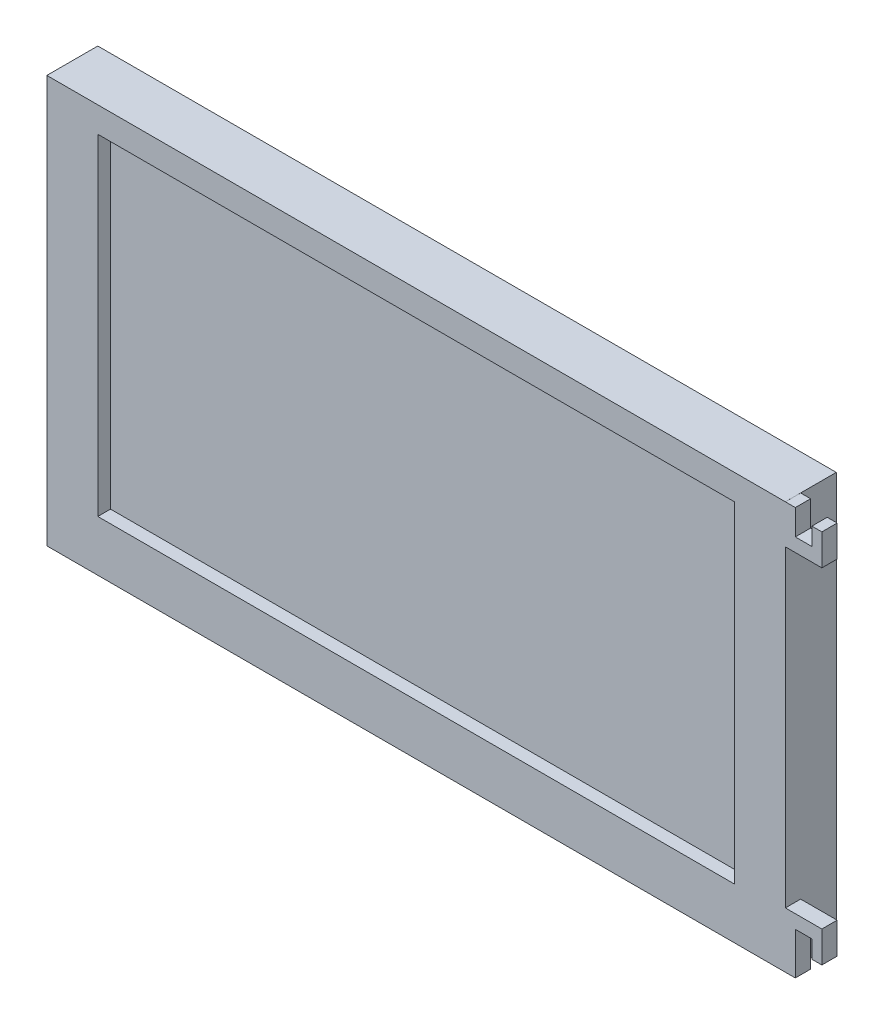
ISO-10303-21;
HEADER;
FILE_DESCRIPTION(('STEP AP214'),'2;1');
FILE_NAME('part.step','',(''),(''),'','','');
FILE_SCHEMA(('AUTOMOTIVE_DESIGN { 1 0 10303 214 1 1 1 1 }'));
ENDSEC;
DATA;
#1=APPLICATION_CONTEXT('core data for automotive mechanical design processes');
#2=APPLICATION_PROTOCOL_DEFINITION('international standard','automotive_design',2000,#1);
#3=PRODUCT_CONTEXT('',#1,'mechanical');
#4=PRODUCT('Part','Part','',(#3));
#5=PRODUCT_RELATED_PRODUCT_CATEGORY('part','',(#4));
#6=PRODUCT_DEFINITION_FORMATION('','',#4);
#7=PRODUCT_DEFINITION_CONTEXT('part definition',#1,'design');
#8=PRODUCT_DEFINITION('design','',#6,#7);
#9=PRODUCT_DEFINITION_SHAPE('','',#8);
#10=(LENGTH_UNIT() NAMED_UNIT(*) SI_UNIT(.MILLI.,.METRE.));
#11=(NAMED_UNIT(*) PLANE_ANGLE_UNIT() SI_UNIT($,.RADIAN.));
#12=(NAMED_UNIT(*) SI_UNIT($,.STERADIAN.) SOLID_ANGLE_UNIT());
#13=UNCERTAINTY_MEASURE_WITH_UNIT(LENGTH_MEASURE(1.E-05),#10,'distance_accuracy_value','');
#14=(GEOMETRIC_REPRESENTATION_CONTEXT(3) GLOBAL_UNCERTAINTY_ASSIGNED_CONTEXT((#13)) GLOBAL_UNIT_ASSIGNED_CONTEXT((#10,
#11,#12)) REPRESENTATION_CONTEXT('',''));
#15=CARTESIAN_POINT('',(0.,0.,0.));
#16=DIRECTION('',(0.,0.,1.));
#17=DIRECTION('',(1.,0.,0.));
#18=AXIS2_PLACEMENT_3D('',#15,#16,#17);
#19=CARTESIAN_POINT('',(184.15,101.6,12.7));
#20=DIRECTION('',(-1.,0.,0.));
#21=DIRECTION('',(0.,0.,1.));
#22=AXIS2_PLACEMENT_3D('',#19,#20,#21);
#23=PLANE('',#22);
#24=DIRECTION('',(0.,1.,0.));
#25=VECTOR('',#24,1.);
#26=CARTESIAN_POINT('',(184.15,101.6,12.7));
#27=LINE('',#26,#25);
#28=CARTESIAN_POINT('',(184.15,101.584884773139,12.7));
#29=VERTEX_POINT('',#28);
#30=CARTESIAN_POINT('',(184.15,101.6,12.7));
#31=VERTEX_POINT('',#30);
#32=EDGE_CURVE('E359',#29,#31,#27,.T.);
#33=ORIENTED_EDGE('',*,*,#32,.F.);
#34=DIRECTION('',(0.,0.,1.));
#35=VECTOR('',#34,1.);
#36=CARTESIAN_POINT('',(184.15,101.584884773139,5.08));
#37=LINE('',#36,#35);
#38=CARTESIAN_POINT('',(184.15,101.584884773139,5.08));
#39=VERTEX_POINT('',#38);
#40=EDGE_CURVE('E221',#39,#29,#37,.T.);
#41=ORIENTED_EDGE('',*,*,#40,.F.);
#42=DIRECTION('',(0.,-1.,0.));
#43=VECTOR('',#42,1.);
#44=CARTESIAN_POINT('',(184.15,88.0125906923723,5.08));
#45=LINE('',#44,#43);
#46=CARTESIAN_POINT('',(184.15,82.1604398677149,5.08));
#47=VERTEX_POINT('',#46);
#48=EDGE_CURVE('E213',#39,#47,#45,.T.);
#49=ORIENTED_EDGE('',*,*,#48,.T.);
#50=DIRECTION('',(0.,0.,1.));
#51=VECTOR('',#50,1.);
#52=CARTESIAN_POINT('',(184.15,82.1604398677149,5.08));
#53=LINE('',#52,#51);
#54=CARTESIAN_POINT('',(184.15,82.1604398677149,12.7));
#55=VERTEX_POINT('',#54);
#56=EDGE_CURVE('E196',#47,#55,#53,.T.);
#57=ORIENTED_EDGE('',*,*,#56,.T.);
#58=CARTESIAN_POINT('',(184.15,-73.8206556166965,12.7));
#59=VERTEX_POINT('',#58);
#60=EDGE_CURVE('E360',#59,#55,#27,.T.);
#61=ORIENTED_EDGE('',*,*,#60,.F.);
#62=DIRECTION('',(0.,0.,1.));
#63=VECTOR('',#62,1.);
#64=CARTESIAN_POINT('',(184.15,-73.8206556166965,5.08));
#65=LINE('',#64,#63);
#66=CARTESIAN_POINT('',(184.15,-73.8206556166965,5.08));
#67=VERTEX_POINT('',#66);
#68=EDGE_CURVE('E306',#67,#59,#65,.T.);
#69=ORIENTED_EDGE('',*,*,#68,.F.);
#70=DIRECTION('',(0.,-1.,0.));
#71=VECTOR('',#70,1.);
#72=CARTESIAN_POINT('',(184.15,-101.6,5.08));
#73=LINE('',#72,#71);
#74=CARTESIAN_POINT('',(184.15,-101.6,5.08));
#75=VERTEX_POINT('',#74);
#76=EDGE_CURVE('E267',#67,#75,#73,.T.);
#77=ORIENTED_EDGE('',*,*,#76,.T.);
#78=DIRECTION('',(0.,0.,-1.));
#79=VECTOR('',#78,1.);
#80=CARTESIAN_POINT('',(184.15,-101.6,12.7));
#81=LINE('',#80,#79);
#82=CARTESIAN_POINT('',(184.15,-101.6,-12.7));
#83=VERTEX_POINT('',#82);
#84=EDGE_CURVE('E47',#75,#83,#81,.T.);
#85=ORIENTED_EDGE('',*,*,#84,.T.);
#86=DIRECTION('',(0.,1.,0.));
#87=VECTOR('',#86,1.);
#88=CARTESIAN_POINT('',(184.15,101.6,-12.7));
#89=LINE('',#88,#87);
#90=CARTESIAN_POINT('',(184.15,101.6,-12.7));
#91=VERTEX_POINT('',#90);
#92=EDGE_CURVE('E370',#83,#91,#89,.T.);
#93=ORIENTED_EDGE('',*,*,#92,.T.);
#94=DIRECTION('',(0.,0.,-1.));
#95=VECTOR('',#94,1.);
#96=CARTESIAN_POINT('',(184.15,101.6,12.7));
#97=LINE('',#96,#95);
#98=EDGE_CURVE('E375',#31,#91,#97,.T.);
#99=ORIENTED_EDGE('',*,*,#98,.F.);
#100=EDGE_LOOP('',(#33,#41,#49,#57,#61,#69,#77,#85,#93,#99));
#101=FACE_BOUND('',#100,.T.);
#102=ADVANCED_FACE('F39',(#101),#23,.F.);
#103=CARTESIAN_POINT('',(-184.15,101.6,12.7));
#104=DIRECTION('',(1.,0.,0.));
#105=DIRECTION('',(0.,0.,-1.));
#106=AXIS2_PLACEMENT_3D('',#103,#104,#105);
#107=PLANE('',#106);
#108=DIRECTION('',(0.,-1.,0.));
#109=VECTOR('',#108,1.);
#110=CARTESIAN_POINT('',(-184.15,101.6,-12.7));
#111=LINE('',#110,#109);
#112=CARTESIAN_POINT('',(-184.15,101.6,-12.7));
#113=VERTEX_POINT('',#112);
#114=CARTESIAN_POINT('',(-184.15,-101.6,-12.7));
#115=VERTEX_POINT('',#114);
#116=EDGE_CURVE('E346',#113,#115,#111,.T.);
#117=ORIENTED_EDGE('',*,*,#116,.T.);
#118=DIRECTION('',(0.,0.,-1.));
#119=VECTOR('',#118,1.);
#120=CARTESIAN_POINT('',(-184.15,-101.6,12.7));
#121=LINE('',#120,#119);
#122=CARTESIAN_POINT('',(-184.15,-101.6,12.7));
#123=VERTEX_POINT('',#122);
#124=EDGE_CURVE('E11',#123,#115,#121,.T.);
#125=ORIENTED_EDGE('',*,*,#124,.F.);
#126=DIRECTION('',(0.,-1.,0.));
#127=VECTOR('',#126,1.);
#128=CARTESIAN_POINT('',(-184.15,101.6,12.7));
#129=LINE('',#128,#127);
#130=CARTESIAN_POINT('',(-184.15,101.6,12.7));
#131=VERTEX_POINT('',#130);
#132=EDGE_CURVE('E353',#131,#123,#129,.T.);
#133=ORIENTED_EDGE('',*,*,#132,.F.);
#134=DIRECTION('',(0.,0.,-1.));
#135=VECTOR('',#134,1.);
#136=CARTESIAN_POINT('',(-184.15,101.6,12.7));
#137=LINE('',#136,#135);
#138=EDGE_CURVE('E364',#131,#113,#137,.T.);
#139=ORIENTED_EDGE('',*,*,#138,.T.);
#140=EDGE_LOOP('',(#117,#125,#133,#139));
#141=FACE_BOUND('',#140,.T.);
#142=ADVANCED_FACE('F41',(#141),#107,.F.);
#143=CARTESIAN_POINT('',(-184.15,-101.6,12.7));
#144=DIRECTION('',(0.,1.,0.));
#145=DIRECTION('',(0.,0.,1.));
#146=AXIS2_PLACEMENT_3D('',#143,#144,#145);
#147=PLANE('',#146);
#148=DIRECTION('',(1.,0.,0.));
#149=VECTOR('',#148,1.);
#150=CARTESIAN_POINT('',(-184.15,-101.6,-12.7));
#151=LINE('',#150,#149);
#152=EDGE_CURVE('E367',#115,#83,#151,.T.);
#153=ORIENTED_EDGE('',*,*,#152,.T.);
#154=ORIENTED_EDGE('',*,*,#84,.F.);
#155=DIRECTION('',(1.,0.,0.));
#156=VECTOR('',#155,1.);
#157=CARTESIAN_POINT('',(184.15,-101.6,5.08));
#158=LINE('',#157,#156);
#159=CARTESIAN_POINT('',(189.1197006928,-101.6,5.08));
#160=VERTEX_POINT('',#159);
#161=EDGE_CURVE('E62',#75,#160,#158,.T.);
#162=ORIENTED_EDGE('',*,*,#161,.T.);
#163=DIRECTION('',(0.,0.,1.));
#164=VECTOR('',#163,1.);
#165=CARTESIAN_POINT('',(189.1197006928,-101.6,5.08));
#166=LINE('',#165,#164);
#167=CARTESIAN_POINT('',(189.1197006928,-101.6,12.7));
#168=VERTEX_POINT('',#167);
#169=EDGE_CURVE('E289',#160,#168,#166,.T.);
#170=ORIENTED_EDGE('',*,*,#169,.T.);
#171=DIRECTION('',(1.,0.,0.));
#172=VECTOR('',#171,1.);
#173=CARTESIAN_POINT('',(-184.15,-101.6,12.7));
#174=LINE('',#173,#172);
#175=EDGE_CURVE('E356',#123,#168,#174,.T.);
#176=ORIENTED_EDGE('',*,*,#175,.F.);
#177=ORIENTED_EDGE('',*,*,#124,.T.);
#178=EDGE_LOOP('',(#153,#154,#162,#170,#176,#177));
#179=FACE_BOUND('',#178,.T.);
#180=ADVANCED_FACE('F382',(#179),#147,.F.);
#181=CARTESIAN_POINT('',(-184.15,101.6,12.7));
#182=DIRECTION('',(0.,-1.,0.));
#183=DIRECTION('',(0.,0.,-1.));
#184=AXIS2_PLACEMENT_3D('',#181,#182,#183);
#185=PLANE('',#184);
#186=DIRECTION('',(-1.,0.,0.));
#187=VECTOR('',#186,1.);
#188=CARTESIAN_POINT('',(-184.15,101.6,-12.7));
#189=LINE('',#188,#187);
#190=EDGE_CURVE('E357',#91,#113,#189,.T.);
#191=ORIENTED_EDGE('',*,*,#190,.T.);
#192=ORIENTED_EDGE('',*,*,#138,.F.);
#193=DIRECTION('',(-1.,0.,0.));
#194=VECTOR('',#193,1.);
#195=CARTESIAN_POINT('',(-184.15,101.6,12.7));
#196=LINE('',#195,#194);
#197=EDGE_CURVE('E362',#31,#131,#196,.T.);
#198=ORIENTED_EDGE('',*,*,#197,.F.);
#199=ORIENTED_EDGE('',*,*,#98,.T.);
#200=EDGE_LOOP('',(#191,#192,#198,#199));
#201=FACE_BOUND('',#200,.T.);
#202=ADVANCED_FACE('F390',(#201),#185,.F.);
#203=CARTESIAN_POINT('',(0.,0.,12.7));
#204=DIRECTION('',(0.,0.,1.));
#205=DIRECTION('',(1.,0.,0.));
#206=AXIS2_PLACEMENT_3D('',#203,#204,#205);
#207=PLANE('',#206);
#208=DIRECTION('',(0.,-1.,0.));
#209=VECTOR('',#208,1.);
#210=CARTESIAN_POINT('',(-158.75,88.9,12.7));
#211=LINE('',#210,#209);
#212=CARTESIAN_POINT('',(-158.75,88.9,12.7));
#213=VERTEX_POINT('',#212);
#214=CARTESIAN_POINT('',(-158.75,-76.2,12.7));
#215=VERTEX_POINT('',#214);
#216=EDGE_CURVE('E308',#213,#215,#211,.T.);
#217=ORIENTED_EDGE('',*,*,#216,.F.);
#218=DIRECTION('',(-1.,0.,0.));
#219=VECTOR('',#218,1.);
#220=CARTESIAN_POINT('',(-158.75,88.9,12.7));
#221=LINE('',#220,#219);
#222=CARTESIAN_POINT('',(158.75,88.9,12.7));
#223=VERTEX_POINT('',#222);
#224=EDGE_CURVE('E325',#223,#213,#221,.T.);
#225=ORIENTED_EDGE('',*,*,#224,.F.);
#226=DIRECTION('',(0.,1.,0.));
#227=VECTOR('',#226,1.);
#228=CARTESIAN_POINT('',(158.75,88.9,12.7));
#229=LINE('',#228,#227);
#230=CARTESIAN_POINT('',(158.75,-76.2,12.7));
#231=VERTEX_POINT('',#230);
#232=EDGE_CURVE('E339',#231,#223,#229,.T.);
#233=ORIENTED_EDGE('',*,*,#232,.F.);
#234=DIRECTION('',(1.,0.,0.));
#235=VECTOR('',#234,1.);
#236=CARTESIAN_POINT('',(-158.75,-76.2,12.7));
#237=LINE('',#236,#235);
#238=EDGE_CURVE('E336',#215,#231,#237,.T.);
#239=ORIENTED_EDGE('',*,*,#238,.F.);
#240=EDGE_LOOP('',(#217,#225,#233,#239));
#241=FACE_BOUND('',#240,.T.);
#242=ORIENTED_EDGE('',*,*,#132,.T.);
#243=ORIENTED_EDGE('',*,*,#175,.T.);
#244=DIRECTION('',(0.,1.,0.));
#245=VECTOR('',#244,1.);
#246=CARTESIAN_POINT('',(189.1197006928,-101.6,12.7));
#247=LINE('',#246,#245);
#248=CARTESIAN_POINT('',(189.1197006928,-80.5602157489815,12.7));
#249=VERTEX_POINT('',#248);
#250=EDGE_CURVE('E255',#168,#249,#247,.T.);
#251=ORIENTED_EDGE('',*,*,#250,.T.);
#252=DIRECTION('',(1.,0.,0.));
#253=VECTOR('',#252,1.);
#254=CARTESIAN_POINT('',(189.1197006928,-80.5602157489815,12.7));
#255=LINE('',#254,#253);
#256=CARTESIAN_POINT('',(197.392455233142,-80.5602157489815,12.7));
#257=VERTEX_POINT('',#256);
#258=EDGE_CURVE('E292',#249,#257,#255,.T.);
#259=ORIENTED_EDGE('',*,*,#258,.T.);
#260=DIRECTION('',(0.,-1.,0.));
#261=VECTOR('',#260,1.);
#262=CARTESIAN_POINT('',(197.392455233142,-80.5602157489815,12.7));
#263=LINE('',#262,#261);
#264=CARTESIAN_POINT('',(197.392455233142,-89.3698935001561,12.7));
#265=VERTEX_POINT('',#264);
#266=EDGE_CURVE('E295',#257,#265,#263,.T.);
#267=ORIENTED_EDGE('',*,*,#266,.T.);
#268=DIRECTION('',(1.,0.,0.));
#269=VECTOR('',#268,1.);
#270=CARTESIAN_POINT('',(202.362155925942,-89.3698935001561,12.7));
#271=LINE('',#270,#269);
#272=CARTESIAN_POINT('',(202.362155925942,-89.3698935001561,12.7));
#273=VERTEX_POINT('',#272);
#274=EDGE_CURVE('E298',#265,#273,#271,.T.);
#275=ORIENTED_EDGE('',*,*,#274,.T.);
#276=DIRECTION('',(0.,1.,0.));
#277=VECTOR('',#276,1.);
#278=CARTESIAN_POINT('',(202.362155925942,-73.8206556166965,12.7));
#279=LINE('',#278,#277);
#280=CARTESIAN_POINT('',(202.362155925942,-73.8206556166965,12.7));
#281=VERTEX_POINT('',#280);
#282=EDGE_CURVE('E301',#273,#281,#279,.T.);
#283=ORIENTED_EDGE('',*,*,#282,.T.);
#284=DIRECTION('',(-1.,0.,0.));
#285=VECTOR('',#284,1.);
#286=CARTESIAN_POINT('',(184.15,-73.8206556166965,12.7));
#287=LINE('',#286,#285);
#288=EDGE_CURVE('E269',#281,#59,#287,.T.);
#289=ORIENTED_EDGE('',*,*,#288,.T.);
#290=ORIENTED_EDGE('',*,*,#60,.T.);
#291=DIRECTION('',(1.,0.,0.));
#292=VECTOR('',#291,1.);
#293=CARTESIAN_POINT('',(184.15,82.1604398677149,12.7));
#294=LINE('',#293,#292);
#295=CARTESIAN_POINT('',(202.362155925942,82.1604398677149,12.7));
#296=VERTEX_POINT('',#295);
#297=EDGE_CURVE('E201',#55,#296,#294,.T.);
#298=ORIENTED_EDGE('',*,*,#297,.T.);
#299=DIRECTION('',(0.,1.,0.));
#300=VECTOR('',#299,1.);
#301=CARTESIAN_POINT('',(202.362155925942,82.1604398677149,12.7));
#302=LINE('',#301,#300);
#303=CARTESIAN_POINT('',(202.362155925942,97.7096777511746,12.7));
#304=VERTEX_POINT('',#303);
#305=EDGE_CURVE('E241',#296,#304,#302,.T.);
#306=ORIENTED_EDGE('',*,*,#305,.T.);
#307=DIRECTION('',(-1.,0.,0.));
#308=VECTOR('',#307,1.);
#309=CARTESIAN_POINT('',(197.392455233142,97.7096777511746,12.7));
#310=LINE('',#309,#308);
#311=CARTESIAN_POINT('',(197.392455233142,97.7096777511746,12.7));
#312=VERTEX_POINT('',#311);
#313=EDGE_CURVE('E244',#304,#312,#310,.T.);
#314=ORIENTED_EDGE('',*,*,#313,.T.);
#315=DIRECTION('',(0.,-1.,0.));
#316=VECTOR('',#315,1.);
#317=CARTESIAN_POINT('',(197.392455233142,88.9,12.7));
#318=LINE('',#317,#316);
#319=CARTESIAN_POINT('',(197.392455233142,88.9,12.7));
#320=VERTEX_POINT('',#319);
#321=EDGE_CURVE('E247',#312,#320,#318,.T.);
#322=ORIENTED_EDGE('',*,*,#321,.T.);
#323=DIRECTION('',(-1.,0.,0.));
#324=VECTOR('',#323,1.);
#325=CARTESIAN_POINT('',(189.1197006928,88.9,12.7));
#326=LINE('',#325,#324);
#327=CARTESIAN_POINT('',(189.1197006928,88.9,12.7));
#328=VERTEX_POINT('',#327);
#329=EDGE_CURVE('E250',#320,#328,#326,.T.);
#330=ORIENTED_EDGE('',*,*,#329,.T.);
#331=DIRECTION('',(0.,1.,0.));
#332=VECTOR('',#331,1.);
#333=CARTESIAN_POINT('',(189.1197006928,88.9,12.7));
#334=LINE('',#333,#332);
#335=CARTESIAN_POINT('',(189.1197006928,101.584884773139,12.7));
#336=VERTEX_POINT('',#335);
#337=EDGE_CURVE('E223',#328,#336,#334,.T.);
#338=ORIENTED_EDGE('',*,*,#337,.T.);
#339=DIRECTION('',(-1.,0.,0.));
#340=VECTOR('',#339,1.);
#341=CARTESIAN_POINT('',(184.15,101.584884773139,12.7));
#342=LINE('',#341,#340);
#343=EDGE_CURVE('E54',#336,#29,#342,.T.);
#344=ORIENTED_EDGE('',*,*,#343,.T.);
#345=ORIENTED_EDGE('',*,*,#32,.T.);
#346=ORIENTED_EDGE('',*,*,#197,.T.);
#347=EDGE_LOOP('',(#242,#243,#251,#259,#267,#275,#283,#289,#290,#298,#306,#314,#322,#330,#338,
#344,#345,#346));
#348=FACE_BOUND('',#347,.T.);
#349=ADVANCED_FACE('F394',(#241,#348),#207,.T.);
#350=CARTESIAN_POINT('',(0.,0.,-12.7));
#351=DIRECTION('',(0.,0.,1.));
#352=DIRECTION('',(1.,0.,0.));
#353=AXIS2_PLACEMENT_3D('',#350,#351,#352);
#354=PLANE('',#353);
#355=ORIENTED_EDGE('',*,*,#116,.F.);
#356=ORIENTED_EDGE('',*,*,#190,.F.);
#357=ORIENTED_EDGE('',*,*,#92,.F.);
#358=ORIENTED_EDGE('',*,*,#152,.F.);
#359=EDGE_LOOP('',(#355,#356,#357,#358));
#360=FACE_BOUND('',#359,.T.);
#361=ADVANCED_FACE('F387',(#360),#354,.F.);
#362=CARTESIAN_POINT('',(-158.75,88.9,6.35));
#363=DIRECTION('',(-1.,0.,0.));
#364=DIRECTION('',(0.,-1.,0.));
#365=AXIS2_PLACEMENT_3D('',#362,#363,#364);
#366=PLANE('',#365);
#367=ORIENTED_EDGE('',*,*,#216,.T.);
#368=DIRECTION('',(0.,0.,1.));
#369=VECTOR('',#368,1.);
#370=CARTESIAN_POINT('',(-158.75,-76.2,6.35));
#371=LINE('',#370,#369);
#372=CARTESIAN_POINT('',(-158.75,-76.2,6.35));
#373=VERTEX_POINT('',#372);
#374=EDGE_CURVE('E334',#373,#215,#371,.T.);
#375=ORIENTED_EDGE('',*,*,#374,.F.);
#376=DIRECTION('',(0.,-1.,0.));
#377=VECTOR('',#376,1.);
#378=CARTESIAN_POINT('',(-158.75,88.9,6.35));
#379=LINE('',#378,#377);
#380=CARTESIAN_POINT('',(-158.75,88.9,6.35));
#381=VERTEX_POINT('',#380);
#382=EDGE_CURVE('E321',#381,#373,#379,.T.);
#383=ORIENTED_EDGE('',*,*,#382,.F.);
#384=DIRECTION('',(0.,0.,1.));
#385=VECTOR('',#384,1.);
#386=CARTESIAN_POINT('',(-158.75,88.9,6.35));
#387=LINE('',#386,#385);
#388=EDGE_CURVE('E344',#381,#213,#387,.T.);
#389=ORIENTED_EDGE('',*,*,#388,.T.);
#390=EDGE_LOOP('',(#367,#375,#383,#389));
#391=FACE_BOUND('',#390,.T.);
#392=ADVANCED_FACE('F467',(#391),#366,.F.);
#393=CARTESIAN_POINT('',(-158.75,88.9,6.35));
#394=DIRECTION('',(0.,1.,0.));
#395=DIRECTION('',(0.,0.,1.));
#396=AXIS2_PLACEMENT_3D('',#393,#394,#395);
#397=PLANE('',#396);
#398=ORIENTED_EDGE('',*,*,#224,.T.);
#399=ORIENTED_EDGE('',*,*,#388,.F.);
#400=DIRECTION('',(-1.,0.,0.));
#401=VECTOR('',#400,1.);
#402=CARTESIAN_POINT('',(-158.75,88.9,6.35));
#403=LINE('',#402,#401);
#404=CARTESIAN_POINT('',(158.75,88.9,6.35));
#405=VERTEX_POINT('',#404);
#406=EDGE_CURVE('E331',#405,#381,#403,.T.);
#407=ORIENTED_EDGE('',*,*,#406,.F.);
#408=DIRECTION('',(0.,0.,1.));
#409=VECTOR('',#408,1.);
#410=CARTESIAN_POINT('',(158.75,88.9,6.35));
#411=LINE('',#410,#409);
#412=EDGE_CURVE('E347',#405,#223,#411,.T.);
#413=ORIENTED_EDGE('',*,*,#412,.T.);
#414=EDGE_LOOP('',(#398,#399,#407,#413));
#415=FACE_BOUND('',#414,.T.);
#416=ADVANCED_FACE('F472',(#415),#397,.F.);
#417=CARTESIAN_POINT('',(158.75,88.9,6.35));
#418=DIRECTION('',(1.,0.,0.));
#419=DIRECTION('',(0.,1.,0.));
#420=AXIS2_PLACEMENT_3D('',#417,#418,#419);
#421=PLANE('',#420);
#422=ORIENTED_EDGE('',*,*,#232,.T.);
#423=ORIENTED_EDGE('',*,*,#412,.F.);
#424=DIRECTION('',(0.,1.,0.));
#425=VECTOR('',#424,1.);
#426=CARTESIAN_POINT('',(158.75,88.9,6.35));
#427=LINE('',#426,#425);
#428=CARTESIAN_POINT('',(158.75,-76.2,6.35));
#429=VERTEX_POINT('',#428);
#430=EDGE_CURVE('E328',#429,#405,#427,.T.);
#431=ORIENTED_EDGE('',*,*,#430,.F.);
#432=DIRECTION('',(0.,0.,1.));
#433=VECTOR('',#432,1.);
#434=CARTESIAN_POINT('',(158.75,-76.2,6.35));
#435=LINE('',#434,#433);
#436=EDGE_CURVE('E349',#429,#231,#435,.T.);
#437=ORIENTED_EDGE('',*,*,#436,.T.);
#438=EDGE_LOOP('',(#422,#423,#431,#437));
#439=FACE_BOUND('',#438,.T.);
#440=ADVANCED_FACE('F478',(#439),#421,.F.);
#441=CARTESIAN_POINT('',(-158.75,-76.2,6.35));
#442=DIRECTION('',(0.,-1.,0.));
#443=DIRECTION('',(0.,0.,-1.));
#444=AXIS2_PLACEMENT_3D('',#441,#442,#443);
#445=PLANE('',#444);
#446=ORIENTED_EDGE('',*,*,#238,.T.);
#447=ORIENTED_EDGE('',*,*,#436,.F.);
#448=DIRECTION('',(1.,0.,0.));
#449=VECTOR('',#448,1.);
#450=CARTESIAN_POINT('',(-158.75,-76.2,6.35));
#451=LINE('',#450,#449);
#452=EDGE_CURVE('E324',#373,#429,#451,.T.);
#453=ORIENTED_EDGE('',*,*,#452,.F.);
#454=ORIENTED_EDGE('',*,*,#374,.T.);
#455=EDGE_LOOP('',(#446,#447,#453,#454));
#456=FACE_BOUND('',#455,.T.);
#457=ADVANCED_FACE('F474',(#456),#445,.F.);
#458=CARTESIAN_POINT('',(0.,0.,6.35));
#459=DIRECTION('',(0.,0.,1.));
#460=DIRECTION('',(1.,0.,0.));
#461=AXIS2_PLACEMENT_3D('',#458,#459,#460);
#462=PLANE('',#461);
#463=ORIENTED_EDGE('',*,*,#382,.T.);
#464=ORIENTED_EDGE('',*,*,#452,.T.);
#465=ORIENTED_EDGE('',*,*,#430,.T.);
#466=ORIENTED_EDGE('',*,*,#406,.T.);
#467=EDGE_LOOP('',(#463,#464,#465,#466));
#468=FACE_BOUND('',#467,.T.);
#469=ADVANCED_FACE('F477',(#468),#462,.T.);
#470=CARTESIAN_POINT('',(184.15,-73.8206556166965,5.08));
#471=DIRECTION('',(0.,1.,0.));
#472=DIRECTION('',(0.,0.,1.));
#473=AXIS2_PLACEMENT_3D('',#470,#471,#472);
#474=PLANE('',#473);
#475=ORIENTED_EDGE('',*,*,#288,.F.);
#476=DIRECTION('',(0.,0.,1.));
#477=VECTOR('',#476,1.);
#478=CARTESIAN_POINT('',(202.362155925942,-73.8206556166965,5.08));
#479=LINE('',#478,#477);
#480=CARTESIAN_POINT('',(202.362155925942,-73.8206556166965,5.08));
#481=VERTEX_POINT('',#480);
#482=EDGE_CURVE('E309',#481,#281,#479,.T.);
#483=ORIENTED_EDGE('',*,*,#482,.F.);
#484=DIRECTION('',(-1.,0.,0.));
#485=VECTOR('',#484,1.);
#486=CARTESIAN_POINT('',(184.15,-73.8206556166965,5.08));
#487=LINE('',#486,#485);
#488=EDGE_CURVE('E286',#481,#67,#487,.T.);
#489=ORIENTED_EDGE('',*,*,#488,.T.);
#490=ORIENTED_EDGE('',*,*,#68,.T.);
#491=EDGE_LOOP('',(#475,#483,#489,#490));
#492=FACE_BOUND('',#491,.T.);
#493=ADVANCED_FACE('F416',(#492),#474,.T.);
#494=CARTESIAN_POINT('',(202.362155925942,-73.8206556166965,5.08));
#495=DIRECTION('',(1.,0.,0.));
#496=DIRECTION('',(0.,0.,-1.));
#497=AXIS2_PLACEMENT_3D('',#494,#495,#496);
#498=PLANE('',#497);
#499=ORIENTED_EDGE('',*,*,#282,.F.);
#500=DIRECTION('',(0.,0.,1.));
#501=VECTOR('',#500,1.);
#502=CARTESIAN_POINT('',(202.362155925942,-89.3698935001561,5.08));
#503=LINE('',#502,#501);
#504=CARTESIAN_POINT('',(202.362155925942,-89.3698935001561,5.08));
#505=VERTEX_POINT('',#504);
#506=EDGE_CURVE('E311',#505,#273,#503,.T.);
#507=ORIENTED_EDGE('',*,*,#506,.F.);
#508=DIRECTION('',(0.,1.,0.));
#509=VECTOR('',#508,1.);
#510=CARTESIAN_POINT('',(202.362155925942,-73.8206556166965,5.08));
#511=LINE('',#510,#509);
#512=EDGE_CURVE('E283',#505,#481,#511,.T.);
#513=ORIENTED_EDGE('',*,*,#512,.T.);
#514=ORIENTED_EDGE('',*,*,#482,.T.);
#515=EDGE_LOOP('',(#499,#507,#513,#514));
#516=FACE_BOUND('',#515,.T.);
#517=ADVANCED_FACE('F413',(#516),#498,.T.);
#518=CARTESIAN_POINT('',(202.362155925942,-89.3698935001561,5.08));
#519=DIRECTION('',(0.,-1.,0.));
#520=DIRECTION('',(0.,0.,-1.));
#521=AXIS2_PLACEMENT_3D('',#518,#519,#520);
#522=PLANE('',#521);
#523=ORIENTED_EDGE('',*,*,#274,.F.);
#524=DIRECTION('',(0.,0.,1.));
#525=VECTOR('',#524,1.);
#526=CARTESIAN_POINT('',(197.392455233142,-89.3698935001561,5.08));
#527=LINE('',#526,#525);
#528=CARTESIAN_POINT('',(197.392455233142,-89.3698935001561,5.08));
#529=VERTEX_POINT('',#528);
#530=EDGE_CURVE('E313',#529,#265,#527,.T.);
#531=ORIENTED_EDGE('',*,*,#530,.F.);
#532=DIRECTION('',(1.,0.,0.));
#533=VECTOR('',#532,1.);
#534=CARTESIAN_POINT('',(202.362155925942,-89.3698935001561,5.08));
#535=LINE('',#534,#533);
#536=EDGE_CURVE('E280',#529,#505,#535,.T.);
#537=ORIENTED_EDGE('',*,*,#536,.T.);
#538=ORIENTED_EDGE('',*,*,#506,.T.);
#539=EDGE_LOOP('',(#523,#531,#537,#538));
#540=FACE_BOUND('',#539,.T.);
#541=ADVANCED_FACE('F409',(#540),#522,.T.);
#542=CARTESIAN_POINT('',(197.392455233142,-80.5602157489815,5.08));
#543=DIRECTION('',(-1.,0.,0.));
#544=DIRECTION('',(0.,0.,1.));
#545=AXIS2_PLACEMENT_3D('',#542,#543,#544);
#546=PLANE('',#545);
#547=ORIENTED_EDGE('',*,*,#266,.F.);
#548=DIRECTION('',(0.,0.,1.));
#549=VECTOR('',#548,1.);
#550=CARTESIAN_POINT('',(197.392455233142,-80.5602157489815,5.08));
#551=LINE('',#550,#549);
#552=CARTESIAN_POINT('',(197.392455233142,-80.5602157489815,5.08));
#553=VERTEX_POINT('',#552);
#554=EDGE_CURVE('E315',#553,#257,#551,.T.);
#555=ORIENTED_EDGE('',*,*,#554,.F.);
#556=DIRECTION('',(0.,-1.,0.));
#557=VECTOR('',#556,1.);
#558=CARTESIAN_POINT('',(197.392455233142,-80.5602157489815,5.08));
#559=LINE('',#558,#557);
#560=EDGE_CURVE('E277',#553,#529,#559,.T.);
#561=ORIENTED_EDGE('',*,*,#560,.T.);
#562=ORIENTED_EDGE('',*,*,#530,.T.);
#563=EDGE_LOOP('',(#547,#555,#561,#562));
#564=FACE_BOUND('',#563,.T.);
#565=ADVANCED_FACE('F405',(#564),#546,.T.);
#566=CARTESIAN_POINT('',(189.1197006928,-80.5602157489815,5.08));
#567=DIRECTION('',(0.,-1.,0.));
#568=DIRECTION('',(0.,0.,-1.));
#569=AXIS2_PLACEMENT_3D('',#566,#567,#568);
#570=PLANE('',#569);
#571=ORIENTED_EDGE('',*,*,#258,.F.);
#572=DIRECTION('',(0.,0.,1.));
#573=VECTOR('',#572,1.);
#574=CARTESIAN_POINT('',(189.1197006928,-80.5602157489815,5.08));
#575=LINE('',#574,#573);
#576=CARTESIAN_POINT('',(189.1197006928,-80.5602157489815,5.08));
#577=VERTEX_POINT('',#576);
#578=EDGE_CURVE('E317',#577,#249,#575,.T.);
#579=ORIENTED_EDGE('',*,*,#578,.F.);
#580=DIRECTION('',(1.,0.,0.));
#581=VECTOR('',#580,1.);
#582=CARTESIAN_POINT('',(189.1197006928,-80.5602157489815,5.08));
#583=LINE('',#582,#581);
#584=EDGE_CURVE('E274',#577,#553,#583,.T.);
#585=ORIENTED_EDGE('',*,*,#584,.T.);
#586=ORIENTED_EDGE('',*,*,#554,.T.);
#587=EDGE_LOOP('',(#571,#579,#585,#586));
#588=FACE_BOUND('',#587,.T.);
#589=ADVANCED_FACE('F401',(#588),#570,.T.);
#590=CARTESIAN_POINT('',(189.1197006928,-101.6,5.08));
#591=DIRECTION('',(1.,0.,0.));
#592=DIRECTION('',(0.,0.,-1.));
#593=AXIS2_PLACEMENT_3D('',#590,#591,#592);
#594=PLANE('',#593);
#595=ORIENTED_EDGE('',*,*,#250,.F.);
#596=ORIENTED_EDGE('',*,*,#169,.F.);
#597=DIRECTION('',(0.,1.,0.));
#598=VECTOR('',#597,1.);
#599=CARTESIAN_POINT('',(189.1197006928,-101.6,5.08));
#600=LINE('',#599,#598);
#601=EDGE_CURVE('E271',#160,#577,#600,.T.);
#602=ORIENTED_EDGE('',*,*,#601,.T.);
#603=ORIENTED_EDGE('',*,*,#578,.T.);
#604=EDGE_LOOP('',(#595,#596,#602,#603));
#605=FACE_BOUND('',#604,.T.);
#606=ADVANCED_FACE('F397',(#605),#594,.T.);
#607=CARTESIAN_POINT('',(0.,0.,5.08));
#608=DIRECTION('',(0.,0.,-1.));
#609=DIRECTION('',(-1.,0.,0.));
#610=AXIS2_PLACEMENT_3D('',#607,#608,#609);
#611=PLANE('',#610);
#612=ORIENTED_EDGE('',*,*,#76,.F.);
#613=ORIENTED_EDGE('',*,*,#488,.F.);
#614=ORIENTED_EDGE('',*,*,#512,.F.);
#615=ORIENTED_EDGE('',*,*,#536,.F.);
#616=ORIENTED_EDGE('',*,*,#560,.F.);
#617=ORIENTED_EDGE('',*,*,#584,.F.);
#618=ORIENTED_EDGE('',*,*,#601,.F.);
#619=ORIENTED_EDGE('',*,*,#161,.F.);
#620=EDGE_LOOP('',(#612,#613,#614,#615,#616,#617,#618,#619));
#621=FACE_BOUND('',#620,.T.);
#622=ADVANCED_FACE('F439',(#621),#611,.T.);
#623=CARTESIAN_POINT('',(184.15,101.584884773139,5.08));
#624=DIRECTION('',(0.,1.,0.));
#625=DIRECTION('',(0.,0.,1.));
#626=AXIS2_PLACEMENT_3D('',#623,#624,#625);
#627=PLANE('',#626);
#628=ORIENTED_EDGE('',*,*,#343,.F.);
#629=DIRECTION('',(0.,0.,1.));
#630=VECTOR('',#629,1.);
#631=CARTESIAN_POINT('',(189.1197006928,101.584884773139,5.08));
#632=LINE('',#631,#630);
#633=CARTESIAN_POINT('',(189.1197006928,101.584884773139,5.08));
#634=VERTEX_POINT('',#633);
#635=EDGE_CURVE('E256',#634,#336,#632,.T.);
#636=ORIENTED_EDGE('',*,*,#635,.F.);
#637=DIRECTION('',(-1.,0.,0.));
#638=VECTOR('',#637,1.);
#639=CARTESIAN_POINT('',(184.15,101.584884773139,5.08));
#640=LINE('',#639,#638);
#641=EDGE_CURVE('E207',#634,#39,#640,.T.);
#642=ORIENTED_EDGE('',*,*,#641,.T.);
#643=ORIENTED_EDGE('',*,*,#40,.T.);
#644=EDGE_LOOP('',(#628,#636,#642,#643));
#645=FACE_BOUND('',#644,.T.);
#646=ADVANCED_FACE('F437',(#645),#627,.T.);
#647=CARTESIAN_POINT('',(189.1197006928,88.9,5.08));
#648=DIRECTION('',(1.,0.,0.));
#649=DIRECTION('',(0.,0.,-1.));
#650=AXIS2_PLACEMENT_3D('',#647,#648,#649);
#651=PLANE('',#650);
#652=ORIENTED_EDGE('',*,*,#337,.F.);
#653=DIRECTION('',(0.,0.,1.));
#654=VECTOR('',#653,1.);
#655=CARTESIAN_POINT('',(189.1197006928,88.9,5.08));
#656=LINE('',#655,#654);
#657=CARTESIAN_POINT('',(189.1197006928,88.9,5.08));
#658=VERTEX_POINT('',#657);
#659=EDGE_CURVE('E258',#658,#328,#656,.T.);
#660=ORIENTED_EDGE('',*,*,#659,.F.);
#661=DIRECTION('',(0.,1.,0.));
#662=VECTOR('',#661,1.);
#663=CARTESIAN_POINT('',(189.1197006928,88.9,5.08));
#664=LINE('',#663,#662);
#665=EDGE_CURVE('E236',#658,#634,#664,.T.);
#666=ORIENTED_EDGE('',*,*,#665,.T.);
#667=ORIENTED_EDGE('',*,*,#635,.T.);
#668=EDGE_LOOP('',(#652,#660,#666,#667));
#669=FACE_BOUND('',#668,.T.);
#670=ADVANCED_FACE('F435',(#669),#651,.T.);
#671=CARTESIAN_POINT('',(189.1197006928,88.9,5.08));
#672=DIRECTION('',(0.,1.,0.));
#673=DIRECTION('',(0.,0.,1.));
#674=AXIS2_PLACEMENT_3D('',#671,#672,#673);
#675=PLANE('',#674);
#676=ORIENTED_EDGE('',*,*,#329,.F.);
#677=DIRECTION('',(0.,0.,1.));
#678=VECTOR('',#677,1.);
#679=CARTESIAN_POINT('',(197.392455233142,88.9,5.08));
#680=LINE('',#679,#678);
#681=CARTESIAN_POINT('',(197.392455233142,88.9,5.08));
#682=VERTEX_POINT('',#681);
#683=EDGE_CURVE('E260',#682,#320,#680,.T.);
#684=ORIENTED_EDGE('',*,*,#683,.F.);
#685=DIRECTION('',(-1.,0.,0.));
#686=VECTOR('',#685,1.);
#687=CARTESIAN_POINT('',(189.1197006928,88.9,5.08));
#688=LINE('',#687,#686);
#689=EDGE_CURVE('E233',#682,#658,#688,.T.);
#690=ORIENTED_EDGE('',*,*,#689,.T.);
#691=ORIENTED_EDGE('',*,*,#659,.T.);
#692=EDGE_LOOP('',(#676,#684,#690,#691));
#693=FACE_BOUND('',#692,.T.);
#694=ADVANCED_FACE('F431',(#693),#675,.T.);
#695=CARTESIAN_POINT('',(197.392455233142,88.9,5.08));
#696=DIRECTION('',(-1.,0.,0.));
#697=DIRECTION('',(0.,0.,1.));
#698=AXIS2_PLACEMENT_3D('',#695,#696,#697);
#699=PLANE('',#698);
#700=ORIENTED_EDGE('',*,*,#321,.F.);
#701=DIRECTION('',(0.,0.,1.));
#702=VECTOR('',#701,1.);
#703=CARTESIAN_POINT('',(197.392455233142,97.7096777511746,5.08));
#704=LINE('',#703,#702);
#705=CARTESIAN_POINT('',(197.392455233142,97.7096777511746,5.08));
#706=VERTEX_POINT('',#705);
#707=EDGE_CURVE('E262',#706,#312,#704,.T.);
#708=ORIENTED_EDGE('',*,*,#707,.F.);
#709=DIRECTION('',(0.,-1.,0.));
#710=VECTOR('',#709,1.);
#711=CARTESIAN_POINT('',(197.392455233142,88.9,5.08));
#712=LINE('',#711,#710);
#713=EDGE_CURVE('E230',#706,#682,#712,.T.);
#714=ORIENTED_EDGE('',*,*,#713,.T.);
#715=ORIENTED_EDGE('',*,*,#683,.T.);
#716=EDGE_LOOP('',(#700,#708,#714,#715));
#717=FACE_BOUND('',#716,.T.);
#718=ADVANCED_FACE('F427',(#717),#699,.T.);
#719=CARTESIAN_POINT('',(197.392455233142,97.7096777511746,5.08));
#720=DIRECTION('',(0.,1.,0.));
#721=DIRECTION('',(0.,0.,1.));
#722=AXIS2_PLACEMENT_3D('',#719,#720,#721);
#723=PLANE('',#722);
#724=ORIENTED_EDGE('',*,*,#313,.F.);
#725=DIRECTION('',(0.,0.,1.));
#726=VECTOR('',#725,1.);
#727=CARTESIAN_POINT('',(202.362155925942,97.7096777511746,5.08));
#728=LINE('',#727,#726);
#729=CARTESIAN_POINT('',(202.362155925942,97.7096777511746,5.08));
#730=VERTEX_POINT('',#729);
#731=EDGE_CURVE('E264',#730,#304,#728,.T.);
#732=ORIENTED_EDGE('',*,*,#731,.F.);
#733=DIRECTION('',(-1.,0.,0.));
#734=VECTOR('',#733,1.);
#735=CARTESIAN_POINT('',(197.392455233142,97.7096777511746,5.08));
#736=LINE('',#735,#734);
#737=EDGE_CURVE('E227',#730,#706,#736,.T.);
#738=ORIENTED_EDGE('',*,*,#737,.T.);
#739=ORIENTED_EDGE('',*,*,#707,.T.);
#740=EDGE_LOOP('',(#724,#732,#738,#739));
#741=FACE_BOUND('',#740,.T.);
#742=ADVANCED_FACE('F423',(#741),#723,.T.);
#743=CARTESIAN_POINT('',(202.362155925942,82.1604398677149,5.08));
#744=DIRECTION('',(1.,0.,0.));
#745=DIRECTION('',(0.,0.,-1.));
#746=AXIS2_PLACEMENT_3D('',#743,#744,#745);
#747=PLANE('',#746);
#748=ORIENTED_EDGE('',*,*,#305,.F.);
#749=DIRECTION('',(0.,0.,1.));
#750=VECTOR('',#749,1.);
#751=CARTESIAN_POINT('',(202.362155925942,82.1604398677149,5.08));
#752=LINE('',#751,#750);
#753=CARTESIAN_POINT('',(202.362155925942,82.1604398677149,5.08));
#754=VERTEX_POINT('',#753);
#755=EDGE_CURVE('E206',#754,#296,#752,.T.);
#756=ORIENTED_EDGE('',*,*,#755,.F.);
#757=DIRECTION('',(0.,1.,0.));
#758=VECTOR('',#757,1.);
#759=CARTESIAN_POINT('',(202.362155925942,82.1604398677149,5.08));
#760=LINE('',#759,#758);
#761=EDGE_CURVE('E217',#754,#730,#760,.T.);
#762=ORIENTED_EDGE('',*,*,#761,.T.);
#763=ORIENTED_EDGE('',*,*,#731,.T.);
#764=EDGE_LOOP('',(#748,#756,#762,#763));
#765=FACE_BOUND('',#764,.T.);
#766=ADVANCED_FACE('F421',(#765),#747,.T.);
#767=CARTESIAN_POINT('',(184.15,82.1604398677149,5.08));
#768=DIRECTION('',(0.,-1.,0.));
#769=DIRECTION('',(0.,0.,-1.));
#770=AXIS2_PLACEMENT_3D('',#767,#768,#769);
#771=PLANE('',#770);
#772=ORIENTED_EDGE('',*,*,#297,.F.);
#773=ORIENTED_EDGE('',*,*,#56,.F.);
#774=DIRECTION('',(1.,0.,0.));
#775=VECTOR('',#774,1.);
#776=CARTESIAN_POINT('',(184.15,82.1604398677149,5.08));
#777=LINE('',#776,#775);
#778=EDGE_CURVE('E199',#47,#754,#777,.T.);
#779=ORIENTED_EDGE('',*,*,#778,.T.);
#780=ORIENTED_EDGE('',*,*,#755,.T.);
#781=EDGE_LOOP('',(#772,#773,#779,#780));
#782=FACE_BOUND('',#781,.T.);
#783=ADVANCED_FACE('F198',(#782),#771,.T.);
#784=CARTESIAN_POINT('',(0.,0.,5.08));
#785=DIRECTION('',(0.,0.,-1.));
#786=DIRECTION('',(-1.,0.,0.));
#787=AXIS2_PLACEMENT_3D('',#784,#785,#786);
#788=PLANE('',#787);
#789=ORIENTED_EDGE('',*,*,#48,.F.);
#790=ORIENTED_EDGE('',*,*,#641,.F.);
#791=ORIENTED_EDGE('',*,*,#665,.F.);
#792=ORIENTED_EDGE('',*,*,#689,.F.);
#793=ORIENTED_EDGE('',*,*,#713,.F.);
#794=ORIENTED_EDGE('',*,*,#737,.F.);
#795=ORIENTED_EDGE('',*,*,#761,.F.);
#796=ORIENTED_EDGE('',*,*,#778,.F.);
#797=EDGE_LOOP('',(#789,#790,#791,#792,#793,#794,#795,#796));
#798=FACE_BOUND('',#797,.T.);
#799=ADVANCED_FACE('F211',(#798),#788,.T.);
#800=CLOSED_SHELL('',(#102,#142,#180,#202,#349,#361,#392,#416,#440,#457,#469,#493,#517,#541,
#565,#589,#606,#622,#646,#670,#694,#718,#742,#766,#783,#799));
#801=MANIFOLD_SOLID_BREP('B2',#800);
#802=ADVANCED_BREP_SHAPE_REPRESENTATION('',(#18,#801),#14);
#803=SHAPE_DEFINITION_REPRESENTATION(#9,#802);
ENDSEC;
END-ISO-10303-21;
